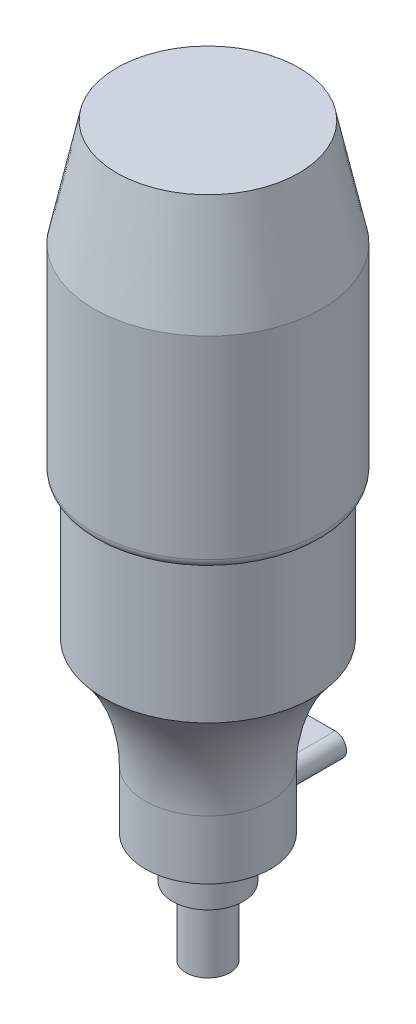
ISO-10303-21;
HEADER;
FILE_DESCRIPTION(('STEP AP214'),'2;1');
FILE_NAME('part.step','',(''),(''),'','','');
FILE_SCHEMA(('AUTOMOTIVE_DESIGN { 1 0 10303 214 1 1 1 1 }'));
ENDSEC;
DATA;
#1=APPLICATION_CONTEXT('core data for automotive mechanical design processes');
#2=APPLICATION_PROTOCOL_DEFINITION('international standard','automotive_design',2000,#1);
#3=PRODUCT_CONTEXT('',#1,'mechanical');
#4=PRODUCT('Part','Part','',(#3));
#5=PRODUCT_RELATED_PRODUCT_CATEGORY('part','',(#4));
#6=PRODUCT_DEFINITION_FORMATION('','',#4);
#7=PRODUCT_DEFINITION_CONTEXT('part definition',#1,'design');
#8=PRODUCT_DEFINITION('design','',#6,#7);
#9=PRODUCT_DEFINITION_SHAPE('','',#8);
#10=(LENGTH_UNIT() NAMED_UNIT(*) SI_UNIT(.MILLI.,.METRE.));
#11=(NAMED_UNIT(*) PLANE_ANGLE_UNIT() SI_UNIT($,.RADIAN.));
#12=(NAMED_UNIT(*) SI_UNIT($,.STERADIAN.) SOLID_ANGLE_UNIT());
#13=UNCERTAINTY_MEASURE_WITH_UNIT(LENGTH_MEASURE(1.E-05),#10,'distance_accuracy_value','');
#14=(GEOMETRIC_REPRESENTATION_CONTEXT(3) GLOBAL_UNCERTAINTY_ASSIGNED_CONTEXT((#13)) GLOBAL_UNIT_ASSIGNED_CONTEXT((#10,
#11,#12)) REPRESENTATION_CONTEXT('',''));
#15=CARTESIAN_POINT('',(0.,0.,0.));
#16=DIRECTION('',(0.,0.,1.));
#17=DIRECTION('',(1.,0.,0.));
#18=AXIS2_PLACEMENT_3D('',#15,#16,#17);
#19=CARTESIAN_POINT('',(24.,173.5,0.));
#20=DIRECTION('',(0.,-1.,0.));
#21=DIRECTION('',(0.,0.,-1.));
#22=AXIS2_PLACEMENT_3D('',#19,#20,#21);
#23=PLANE('',#22);
#24=CARTESIAN_POINT('',(0.,173.5,0.));
#25=DIRECTION('',(0.,1.,0.));
#26=DIRECTION('',(0.,0.,1.));
#27=AXIS2_PLACEMENT_3D('',#24,#25,#26);
#28=CIRCLE('',#27,24.);
#29=CARTESIAN_POINT('',(0.,173.5,24.));
#30=VERTEX_POINT('',#29);
#31=EDGE_CURVE('E146',#30,#30,#28,.T.);
#32=ORIENTED_EDGE('',*,*,#31,.T.);
#33=EDGE_LOOP('',(#32));
#34=FACE_BOUND('',#33,.T.);
#35=ADVANCED_FACE('F33',(#34),#23,.F.);
#36=CARTESIAN_POINT('',(0.,-18.,0.));
#37=DIRECTION('',(0.,1.,0.));
#38=DIRECTION('',(0.,0.,1.));
#39=AXIS2_PLACEMENT_3D('',#36,#37,#38);
#40=PLANE('',#39);
#41=CARTESIAN_POINT('',(0.,-18.,0.));
#42=DIRECTION('',(0.,1.,0.));
#43=DIRECTION('',(0.,0.,1.));
#44=AXIS2_PLACEMENT_3D('',#41,#42,#43);
#45=CIRCLE('',#44,5.8);
#46=CARTESIAN_POINT('',(0.,-18.,5.8));
#47=VERTEX_POINT('',#46);
#48=EDGE_CURVE('E176',#47,#47,#45,.T.);
#49=ORIENTED_EDGE('',*,*,#48,.F.);
#50=EDGE_LOOP('',(#49));
#51=FACE_BOUND('',#50,.T.);
#52=ADVANCED_FACE('F293',(#51),#40,.F.);
#53=CARTESIAN_POINT('',(0.,182.175,0.));
#54=DIRECTION('',(0.,1.,0.));
#55=DIRECTION('',(0.,0.,1.));
#56=AXIS2_PLACEMENT_3D('',#53,#54,#55);
#57=CYLINDRICAL_SURFACE('',#56,5.8);
#58=CARTESIAN_POINT('',(0.,0.,0.));
#59=DIRECTION('',(0.,1.,0.));
#60=DIRECTION('',(0.,0.,1.));
#61=AXIS2_PLACEMENT_3D('',#58,#59,#60);
#62=CIRCLE('',#61,5.8);
#63=CARTESIAN_POINT('',(0.,0.,5.8));
#64=VERTEX_POINT('',#63);
#65=EDGE_CURVE('E173',#64,#64,#62,.T.);
#66=ORIENTED_EDGE('',*,*,#65,.F.);
#67=EDGE_LOOP('',(#66));
#68=FACE_BOUND('',#67,.T.);
#69=ORIENTED_EDGE('',*,*,#48,.T.);
#70=EDGE_LOOP('',(#69));
#71=FACE_BOUND('',#70,.T.);
#72=ADVANCED_FACE('F287',(#68,#71),#57,.T.);
#73=CARTESIAN_POINT('',(5.8,0.,0.));
#74=DIRECTION('',(0.,1.,0.));
#75=DIRECTION('',(0.,0.,1.));
#76=AXIS2_PLACEMENT_3D('',#73,#74,#75);
#77=PLANE('',#76);
#78=CARTESIAN_POINT('',(0.,0.,0.));
#79=DIRECTION('',(0.,1.,0.));
#80=DIRECTION('',(0.,0.,1.));
#81=AXIS2_PLACEMENT_3D('',#78,#79,#80);
#82=CIRCLE('',#81,9.3);
#83=CARTESIAN_POINT('',(0.,0.,9.3));
#84=VERTEX_POINT('',#83);
#85=EDGE_CURVE('E170',#84,#84,#82,.T.);
#86=ORIENTED_EDGE('',*,*,#85,.F.);
#87=EDGE_LOOP('',(#86));
#88=FACE_BOUND('',#87,.T.);
#89=ORIENTED_EDGE('',*,*,#65,.T.);
#90=EDGE_LOOP('',(#89));
#91=FACE_BOUND('',#90,.T.);
#92=ADVANCED_FACE('F281',(#88,#91),#77,.F.);
#93=CARTESIAN_POINT('',(0.,182.175,0.));
#94=DIRECTION('',(0.,1.,0.));
#95=DIRECTION('',(0.,0.,1.));
#96=AXIS2_PLACEMENT_3D('',#93,#94,#95);
#97=CYLINDRICAL_SURFACE('',#96,9.3);
#98=CARTESIAN_POINT('',(0.,11.,0.));
#99=DIRECTION('',(0.,1.,0.));
#100=DIRECTION('',(0.,0.,1.));
#101=AXIS2_PLACEMENT_3D('',#98,#99,#100);
#102=CIRCLE('',#101,9.3);
#103=CARTESIAN_POINT('',(0.,11.,9.3));
#104=VERTEX_POINT('',#103);
#105=EDGE_CURVE('E167',#104,#104,#102,.T.);
#106=ORIENTED_EDGE('',*,*,#105,.F.);
#107=EDGE_LOOP('',(#106));
#108=FACE_BOUND('',#107,.T.);
#109=ORIENTED_EDGE('',*,*,#85,.T.);
#110=EDGE_LOOP('',(#109));
#111=FACE_BOUND('',#110,.T.);
#112=ADVANCED_FACE('F275',(#108,#111),#97,.T.);
#113=CARTESIAN_POINT('',(9.3,11.,0.));
#114=DIRECTION('',(0.,1.,0.));
#115=DIRECTION('',(0.,0.,1.));
#116=AXIS2_PLACEMENT_3D('',#113,#114,#115);
#117=PLANE('',#116);
#118=CARTESIAN_POINT('',(0.,11.,0.));
#119=DIRECTION('',(0.,1.,0.));
#120=DIRECTION('',(0.,0.,1.));
#121=AXIS2_PLACEMENT_3D('',#118,#119,#120);
#122=CIRCLE('',#121,16.5);
#123=CARTESIAN_POINT('',(0.,11.,16.5));
#124=VERTEX_POINT('',#123);
#125=EDGE_CURVE('E164',#124,#124,#122,.T.);
#126=ORIENTED_EDGE('',*,*,#125,.F.);
#127=EDGE_LOOP('',(#126));
#128=FACE_BOUND('',#127,.T.);
#129=ORIENTED_EDGE('',*,*,#105,.T.);
#130=EDGE_LOOP('',(#129));
#131=FACE_BOUND('',#130,.T.);
#132=ADVANCED_FACE('F269',(#128,#131),#117,.F.);
#133=CARTESIAN_POINT('',(0.,182.175,0.));
#134=DIRECTION('',(0.,1.,0.));
#135=DIRECTION('',(0.,0.,1.));
#136=AXIS2_PLACEMENT_3D('',#133,#134,#135);
#137=CYLINDRICAL_SURFACE('',#136,16.5);
#138=CARTESIAN_POINT('',(0.,15.,0.));
#139=DIRECTION('',(0.,-1.,0.));
#140=DIRECTION('',(0.,0.,-1.));
#141=AXIS2_PLACEMENT_3D('',#138,#139,#140);
#142=CIRCLE('',#141,16.5);
#143=CARTESIAN_POINT('',(3.5,15.,-16.1245154965971));
#144=VERTEX_POINT('',#143);
#145=CARTESIAN_POINT('',(-3.5,15.,-16.1245154965971));
#146=VERTEX_POINT('',#145);
#147=EDGE_CURVE('E106',#144,#146,#142,.F.);
#148=ORIENTED_EDGE('',*,*,#147,.F.);
#149=CARTESIAN_POINT('',(3.5,21.,-16.1245154965971));
#150=CARTESIAN_POINT('',(3.58719127679948,21.0000074508517,-16.1055968253464));
#151=CARTESIAN_POINT('',(3.67421481993883,20.9961990738604,-16.0859599448483));
#152=CARTESIAN_POINT('',(3.84729596228067,20.9810934997403,-16.0454402048859));
#153=CARTESIAN_POINT('',(3.93335378785766,20.9697980965858,-16.0245576449907));
#154=CARTESIAN_POINT('',(4.10379322690174,20.9398826125012,-15.9817584167738));
#155=CARTESIAN_POINT('',(4.1881770646077,20.921273045604,-15.9598432724049));
#156=CARTESIAN_POINT('',(4.35480620692929,20.8769338000175,-15.9151851483464));
#157=CARTESIAN_POINT('',(4.43705141588591,20.8512038034347,-15.8924421317356));
#158=CARTESIAN_POINT('',(4.67968699823152,20.7636639678951,-15.8233585287546));
#159=CARTESIAN_POINT('',(4.83620961326289,20.6914629880383,-15.7761045186265));
#160=CARTESIAN_POINT('',(5.13458594513931,20.5214415567286,-15.6815374149478));
#161=CARTESIAN_POINT('',(5.27643502547025,20.4236130418209,-15.6342243074741));
#162=CARTESIAN_POINT('',(5.54417730074027,20.2027170113893,-15.5413166629808));
#163=CARTESIAN_POINT('',(5.66974749704768,20.0792374299611,-15.4957667437151));
#164=CARTESIAN_POINT('',(5.89814068606809,19.8110578735611,-15.4102838447277));
#165=CARTESIAN_POINT('',(6.00096592353674,19.666359995021,-15.370350310853));
#166=CARTESIAN_POINT('',(6.17752003050969,19.3640379731879,-15.3002298263366));
#167=CARTESIAN_POINT('',(6.25202617471471,19.2069289534308,-15.2697874039371));
#168=CARTESIAN_POINT('',(6.37308011696212,18.88069631611,-15.2196647238644));
#169=CARTESIAN_POINT('',(6.41964598912823,18.7115805448899,-15.1999775095553));
#170=CARTESIAN_POINT('',(6.48031831366827,18.3795586988583,-15.1742044107183));
#171=CARTESIAN_POINT('',(6.49656030885867,18.2171107903206,-15.1672246252516));
#172=CARTESIAN_POINT('',(6.50245363172151,17.8916630628638,-15.164699754293));
#173=CARTESIAN_POINT('',(6.49211205501401,17.7286634028151,-15.169151617494));
#174=CARTESIAN_POINT('',(6.44637763095886,17.4143706402084,-15.1886396214108));
#175=CARTESIAN_POINT('',(6.41212139508058,17.2628795220314,-15.2031953747814));
#176=CARTESIAN_POINT('',(6.32113626560412,16.9680086673929,-15.2412482788976));
#177=CARTESIAN_POINT('',(6.26440469035645,16.8246299011922,-15.2647464966019));
#178=CARTESIAN_POINT('',(6.12841750272051,16.5452579681431,-15.3198568386538));
#179=CARTESIAN_POINT('',(6.0485428578337,16.409610718692,-15.3516892574004));
#180=CARTESIAN_POINT('',(5.86947845487117,16.1533751152837,-15.421038408399));
#181=CARTESIAN_POINT('',(5.7702835757904,16.0327907678262,-15.4585566471432));
#182=CARTESIAN_POINT('',(5.54743755286521,15.8009871150444,-15.5399796322453));
#183=CARTESIAN_POINT('',(5.42254504873753,15.691053469669,-15.5841491959985));
#184=CARTESIAN_POINT('',(5.15667728711588,15.4934333192057,-15.6741305833183));
#185=CARTESIAN_POINT('',(5.01569191030875,15.405760925106,-15.7199434276385));
#186=CARTESIAN_POINT('',(4.71350163427726,15.2508716675908,-15.8132589784135));
#187=CARTESIAN_POINT('',(4.5516311284627,15.1849317097264,-15.8607281352226));
#188=CARTESIAN_POINT('',(4.21826057498766,15.0820513154495,-15.9526181197649));
#189=CARTESIAN_POINT('',(4.04677662364551,15.0450638697754,-15.9970437816325));
#190=CARTESIAN_POINT('',(3.81125976849235,15.0155384573525,-16.0539212041423));
#191=CARTESIAN_POINT('',(3.74920977800103,15.0097167714554,-16.0685256961092));
#192=CARTESIAN_POINT('',(3.62480879921612,15.001952063509,-16.0970436300113));
#193=CARTESIAN_POINT('',(3.56245840693183,15.000003197774,-16.1109580821621));
#194=CARTESIAN_POINT('',(3.5,15.,-16.1245154965971));
#195=B_SPLINE_CURVE_WITH_KNOTS('',3,(#149,#150,#151,#152,#153,#154,#155,#156,#157,#158,#159,
#160,#161,#162,#163,#164,#165,#166,#167,#168,#169,#170,#171,#172,#173,#174,#175,#176,#177,#178,
#179,#180,#181,#182,#183,#184,#185,#186,#187,#188,#189,#190,#191,#192,#193,#194),.UNSPECIFIED.,
.F.,.F.,(4,2,2,2,2,2,2,2,2,2,2,2,2,2,2,2,2,2,2,2,2,2,4),(0.,0.267557931060892,0.535051775445972,
0.80216249841422,1.06928514853312,1.60280998398802,2.13650288988991,2.67954382276263,
3.22253113766098,3.74930158347184,4.27573090133389,4.76344020510647,5.2510193442581,
5.71687584889622,6.18278795404217,6.66254034755478,7.14242007731306,7.65660403134237,
8.17111310778129,8.71196075663605,9.25192841645767,9.44386758835397,9.63551692328279),.UNSPECIFIED.);
#196=CARTESIAN_POINT('',(3.5,21.,-16.1245154965971));
#197=VERTEX_POINT('',#196);
#198=EDGE_CURVE('E96',#197,#144,#195,.T.);
#199=ORIENTED_EDGE('',*,*,#198,.F.);
#200=CARTESIAN_POINT('',(0.,21.,0.));
#201=DIRECTION('',(0.,1.,0.));
#202=DIRECTION('',(0.,0.,1.));
#203=AXIS2_PLACEMENT_3D('',#200,#201,#202);
#204=CIRCLE('',#203,16.5);
#205=CARTESIAN_POINT('',(-3.5,21.,-16.1245154965971));
#206=VERTEX_POINT('',#205);
#207=EDGE_CURVE('E115',#206,#197,#204,.F.);
#208=ORIENTED_EDGE('',*,*,#207,.F.);
#209=CARTESIAN_POINT('',(-3.5,15.,-16.1245154965971));
#210=CARTESIAN_POINT('',(-3.58719127679948,14.9999925491483,-16.1055968253464));
#211=CARTESIAN_POINT('',(-3.67421481993883,15.0038009261396,-16.0859599448483));
#212=CARTESIAN_POINT('',(-3.84729596228066,15.0189065002597,-16.0454402048859));
#213=CARTESIAN_POINT('',(-3.93335378785766,15.0302019034143,-16.0245576449907));
#214=CARTESIAN_POINT('',(-4.10379322690174,15.0601173874988,-15.9817584167738));
#215=CARTESIAN_POINT('',(-4.1881770646077,15.078726954396,-15.9598432724049));
#216=CARTESIAN_POINT('',(-4.35480620692929,15.1230661999825,-15.9151851483464));
#217=CARTESIAN_POINT('',(-4.43705141588591,15.1487961965653,-15.8924421317356));
#218=CARTESIAN_POINT('',(-4.67968699823152,15.2363360321049,-15.8233585287546));
#219=CARTESIAN_POINT('',(-4.83620961326289,15.3085370119617,-15.7761045186265));
#220=CARTESIAN_POINT('',(-5.1345859451393,15.4785584432714,-15.6815374149478));
#221=CARTESIAN_POINT('',(-5.27643502547025,15.5763869581791,-15.6342243074741));
#222=CARTESIAN_POINT('',(-5.54417730074027,15.7972829886107,-15.5413166629808));
#223=CARTESIAN_POINT('',(-5.66974749704768,15.9207625700389,-15.4957667437151));
#224=CARTESIAN_POINT('',(-5.89814068606809,16.1889421264389,-15.4102838447277));
#225=CARTESIAN_POINT('',(-6.00096592353674,16.333640004979,-15.370350310853));
#226=CARTESIAN_POINT('',(-6.17752003050969,16.6359620268121,-15.3002298263366));
#227=CARTESIAN_POINT('',(-6.25202617471471,16.7930710465692,-15.2697874039371));
#228=CARTESIAN_POINT('',(-6.37308011696212,17.11930368389,-15.2196647238644));
#229=CARTESIAN_POINT('',(-6.41964598912823,17.2884194551102,-15.1999775095553));
#230=CARTESIAN_POINT('',(-6.48031831366827,17.6204413011418,-15.1742044107183));
#231=CARTESIAN_POINT('',(-6.49656030885867,17.7828892096794,-15.1672246252516));
#232=CARTESIAN_POINT('',(-6.50245363172151,18.1083369371362,-15.164699754293));
#233=CARTESIAN_POINT('',(-6.49211205501401,18.2713365971849,-15.169151617494));
#234=CARTESIAN_POINT('',(-6.44637763095886,18.5856293597916,-15.1886396214108));
#235=CARTESIAN_POINT('',(-6.41212139508058,18.7371204779686,-15.2031953747814));
#236=CARTESIAN_POINT('',(-6.32113626560412,19.0319913326071,-15.2412482788976));
#237=CARTESIAN_POINT('',(-6.26440469035645,19.1753700988078,-15.2647464966019));
#238=CARTESIAN_POINT('',(-6.12841750272051,19.4547420318569,-15.3198568386538));
#239=CARTESIAN_POINT('',(-6.0485428578337,19.590389281308,-15.3516892574004));
#240=CARTESIAN_POINT('',(-5.86947845487117,19.8466248847163,-15.421038408399));
#241=CARTESIAN_POINT('',(-5.7702835757904,19.9672092321738,-15.4585566471432));
#242=CARTESIAN_POINT('',(-5.54743755286521,20.1990128849556,-15.5399796322453));
#243=CARTESIAN_POINT('',(-5.42254504873753,20.3089465303311,-15.5841491959985));
#244=CARTESIAN_POINT('',(-5.15667728711588,20.5065666807944,-15.6741305833183));
#245=CARTESIAN_POINT('',(-5.01569191030875,20.594239074894,-15.7199434276385));
#246=CARTESIAN_POINT('',(-4.71350163427726,20.7491283324093,-15.8132589784135));
#247=CARTESIAN_POINT('',(-4.5516311284627,20.8150682902736,-15.8607281352226));
#248=CARTESIAN_POINT('',(-4.21826057498766,20.9179486845505,-15.9526181197649));
#249=CARTESIAN_POINT('',(-4.04677662364551,20.9549361302247,-15.9970437816325));
#250=CARTESIAN_POINT('',(-3.81125976849236,20.9844615426476,-16.0539212041423));
#251=CARTESIAN_POINT('',(-3.74920977800103,20.9902832285447,-16.0685256961092));
#252=CARTESIAN_POINT('',(-3.62480879921612,20.998047936491,-16.0970436300113));
#253=CARTESIAN_POINT('',(-3.56245840693183,20.999996802226,-16.1109580821621));
#254=CARTESIAN_POINT('',(-3.5,21.,-16.1245154965971));
#255=B_SPLINE_CURVE_WITH_KNOTS('',3,(#209,#210,#211,#212,#213,#214,#215,#216,#217,#218,#219,
#220,#221,#222,#223,#224,#225,#226,#227,#228,#229,#230,#231,#232,#233,#234,#235,#236,#237,#238,
#239,#240,#241,#242,#243,#244,#245,#246,#247,#248,#249,#250,#251,#252,#253,#254),.UNSPECIFIED.,
.F.,.F.,(4,2,2,2,2,2,2,2,2,2,2,2,2,2,2,2,2,2,2,2,2,2,4),(0.,0.267557931060892,0.535051775445972,
0.802162498414222,1.06928514853312,1.60280998398802,2.13650288988991,2.67954382276263,
3.22253113766098,3.74930158347184,4.27573090133389,4.76344020510647,5.2510193442581,
5.71687584889622,6.18278795404217,6.66254034755478,7.14242007731306,7.65660403134237,
8.17111310778128,8.71196075663605,9.25192841645767,9.44386758835397,9.63551692328279),.UNSPECIFIED.);
#256=EDGE_CURVE('E120',#146,#206,#255,.T.);
#257=ORIENTED_EDGE('',*,*,#256,.F.);
#258=EDGE_LOOP('',(#148,#199,#208,#257));
#259=FACE_BOUND('',#258,.T.);
#260=CARTESIAN_POINT('',(0.,26.5,0.));
#261=DIRECTION('',(0.,1.,0.));
#262=DIRECTION('',(0.,0.,1.));
#263=AXIS2_PLACEMENT_3D('',#260,#261,#262);
#264=CIRCLE('',#263,16.5);
#265=CARTESIAN_POINT('',(0.,26.5,16.5));
#266=VERTEX_POINT('',#265);
#267=EDGE_CURVE('E161',#266,#266,#264,.T.);
#268=ORIENTED_EDGE('',*,*,#267,.F.);
#269=EDGE_LOOP('',(#268));
#270=FACE_BOUND('',#269,.T.);
#271=ORIENTED_EDGE('',*,*,#125,.T.);
#272=EDGE_LOOP('',(#271));
#273=FACE_BOUND('',#272,.T.);
#274=ADVANCED_FACE('F118',(#259,#270,#273),#137,.T.);
#275=CARTESIAN_POINT('',(0.,26.5,0.));
#276=DIRECTION('',(0.,1.,0.));
#277=DIRECTION('',(0.,0.,1.));
#278=AXIS2_PLACEMENT_3D('',#275,#276,#277);
#279=TOROIDAL_SURFACE('',#278,60.2272727272728,43.7272727272728);
#280=CARTESIAN_POINT('',(0.,55.5,0.));
#281=DIRECTION('',(0.,1.,0.));
#282=DIRECTION('',(0.,0.,1.));
#283=AXIS2_PLACEMENT_3D('',#280,#281,#282);
#284=CIRCLE('',#283,27.5);
#285=CARTESIAN_POINT('',(0.,55.5,27.5));
#286=VERTEX_POINT('',#285);
#287=EDGE_CURVE('E158',#286,#286,#284,.T.);
#288=ORIENTED_EDGE('',*,*,#287,.F.);
#289=EDGE_LOOP('',(#288));
#290=FACE_BOUND('',#289,.T.);
#291=ORIENTED_EDGE('',*,*,#267,.T.);
#292=EDGE_LOOP('',(#291));
#293=FACE_BOUND('',#292,.T.);
#294=ADVANCED_FACE('F259',(#290,#293),#279,.F.);
#295=CARTESIAN_POINT('',(0.,182.175,0.));
#296=DIRECTION('',(0.,1.,0.));
#297=DIRECTION('',(0.,0.,1.));
#298=AXIS2_PLACEMENT_3D('',#295,#296,#297);
#299=CYLINDRICAL_SURFACE('',#298,27.5);
#300=CARTESIAN_POINT('',(0.,92.,0.));
#301=DIRECTION('',(0.,1.,0.));
#302=DIRECTION('',(0.,0.,1.));
#303=AXIS2_PLACEMENT_3D('',#300,#301,#302);
#304=CIRCLE('',#303,27.5);
#305=CARTESIAN_POINT('',(0.,92.,27.5));
#306=VERTEX_POINT('',#305);
#307=EDGE_CURVE('E155',#306,#306,#304,.T.);
#308=ORIENTED_EDGE('',*,*,#307,.F.);
#309=EDGE_LOOP('',(#308));
#310=FACE_BOUND('',#309,.T.);
#311=ORIENTED_EDGE('',*,*,#287,.T.);
#312=EDGE_LOOP('',(#311));
#313=FACE_BOUND('',#312,.T.);
#314=ADVANCED_FACE('F253',(#310,#313),#299,.T.);
#315=CARTESIAN_POINT('',(0.,94.5,0.));
#316=DIRECTION('',(0.,1.,0.));
#317=DIRECTION('',(0.,0.,1.));
#318=AXIS2_PLACEMENT_3D('',#315,#316,#317);
#319=TOROIDAL_SURFACE('',#318,27.5,2.5);
#320=CARTESIAN_POINT('',(0.,94.5,0.));
#321=DIRECTION('',(0.,1.,0.));
#322=DIRECTION('',(0.,0.,1.));
#323=AXIS2_PLACEMENT_3D('',#320,#321,#322);
#324=CIRCLE('',#323,30.);
#325=CARTESIAN_POINT('',(0.,94.5,30.));
#326=VERTEX_POINT('',#325);
#327=EDGE_CURVE('E152',#326,#326,#324,.T.);
#328=ORIENTED_EDGE('',*,*,#327,.F.);
#329=EDGE_LOOP('',(#328));
#330=FACE_BOUND('',#329,.T.);
#331=ORIENTED_EDGE('',*,*,#307,.T.);
#332=EDGE_LOOP('',(#331));
#333=FACE_BOUND('',#332,.T.);
#334=ADVANCED_FACE('F245',(#330,#333),#319,.T.);
#335=CARTESIAN_POINT('',(0.,182.175,0.));
#336=DIRECTION('',(0.,1.,0.));
#337=DIRECTION('',(0.,0.,1.));
#338=AXIS2_PLACEMENT_3D('',#335,#336,#337);
#339=CYLINDRICAL_SURFACE('',#338,30.);
#340=CARTESIAN_POINT('',(0.,118.,0.));
#341=DIRECTION('',(0.,-1.,0.));
#342=DIRECTION('',(0.,0.,-1.));
#343=AXIS2_PLACEMENT_3D('',#340,#341,#342);
#344=CIRCLE('',#343,30.);
#345=CARTESIAN_POINT('',(-19.,118.,-23.2163735324878));
#346=VERTEX_POINT('',#345);
#347=CARTESIAN_POINT('',(19.,118.,-23.2163735324878));
#348=VERTEX_POINT('',#347);
#349=EDGE_CURVE('E128',#346,#348,#344,.T.);
#350=ORIENTED_EDGE('',*,*,#349,.T.);
#351=DIRECTION('',(0.,1.,0.));
#352=VECTOR('',#351,1.);
#353=CARTESIAN_POINT('',(19.,182.175,-23.2163735324878));
#354=LINE('',#353,#352);
#355=CARTESIAN_POINT('',(19.,135.5,-23.2163735324878));
#356=VERTEX_POINT('',#355);
#357=EDGE_CURVE('E143',#348,#356,#354,.T.);
#358=ORIENTED_EDGE('',*,*,#357,.T.);
#359=CARTESIAN_POINT('',(0.,135.5,0.));
#360=DIRECTION('',(0.,1.,0.));
#361=DIRECTION('',(0.,0.,1.));
#362=AXIS2_PLACEMENT_3D('',#359,#360,#361);
#363=CIRCLE('',#362,30.);
#364=CARTESIAN_POINT('',(-19.,135.5,-23.2163735324878));
#365=VERTEX_POINT('',#364);
#366=EDGE_CURVE('E141',#356,#365,#363,.T.);
#367=ORIENTED_EDGE('',*,*,#366,.T.);
#368=DIRECTION('',(0.,1.,0.));
#369=VECTOR('',#368,1.);
#370=CARTESIAN_POINT('',(-19.,182.175,-23.2163735324878));
#371=LINE('',#370,#369);
#372=EDGE_CURVE('E138',#365,#346,#371,.F.);
#373=ORIENTED_EDGE('',*,*,#372,.T.);
#374=EDGE_LOOP('',(#350,#358,#367,#373));
#375=FACE_BOUND('',#374,.T.);
#376=CARTESIAN_POINT('',(0.,145.5,0.));
#377=DIRECTION('',(0.,1.,0.));
#378=DIRECTION('',(0.,0.,1.));
#379=AXIS2_PLACEMENT_3D('',#376,#377,#378);
#380=CIRCLE('',#379,30.);
#381=CARTESIAN_POINT('',(0.,145.5,30.));
#382=VERTEX_POINT('',#381);
#383=EDGE_CURVE('E149',#382,#382,#380,.T.);
#384=ORIENTED_EDGE('',*,*,#383,.F.);
#385=EDGE_LOOP('',(#384));
#386=FACE_BOUND('',#385,.T.);
#387=ORIENTED_EDGE('',*,*,#327,.T.);
#388=EDGE_LOOP('',(#387));
#389=FACE_BOUND('',#388,.T.);
#390=ADVANCED_FACE('F241',(#375,#386,#389),#339,.T.);
#391=CARTESIAN_POINT('',(0.,145.5,0.));
#392=DIRECTION('',(0.,-1.,0.));
#393=DIRECTION('',(0.,0.,-1.));
#394=AXIS2_PLACEMENT_3D('',#391,#392,#393);
#395=CONICAL_SURFACE('',#394,30.,0.211093333222746);
#396=ORIENTED_EDGE('',*,*,#31,.F.);
#397=EDGE_LOOP('',(#396));
#398=FACE_BOUND('',#397,.T.);
#399=ORIENTED_EDGE('',*,*,#383,.T.);
#400=EDGE_LOOP('',(#399));
#401=FACE_BOUND('',#400,.T.);
#402=ADVANCED_FACE('F244',(#398,#401),#395,.T.);
#403=CARTESIAN_POINT('',(19.,135.5,-20.));
#404=DIRECTION('',(1.,0.,0.));
#405=DIRECTION('',(0.,1.,0.));
#406=AXIS2_PLACEMENT_3D('',#403,#404,#405);
#407=PLANE('',#406);
#408=DIRECTION('',(0.,0.,-1.));
#409=VECTOR('',#408,1.);
#410=CARTESIAN_POINT('',(19.,118.,-20.));
#411=LINE('',#410,#409);
#412=CARTESIAN_POINT('',(19.,118.,-21.9089023002066));
#413=VERTEX_POINT('',#412);
#414=EDGE_CURVE('E133',#413,#348,#411,.T.);
#415=ORIENTED_EDGE('',*,*,#414,.F.);
#416=DIRECTION('',(0.,1.,0.));
#417=VECTOR('',#416,1.);
#418=CARTESIAN_POINT('',(19.,182.175,-21.9089023002066));
#419=LINE('',#418,#417);
#420=CARTESIAN_POINT('',(19.,135.5,-21.9089023002066));
#421=VERTEX_POINT('',#420);
#422=EDGE_CURVE('E11',#413,#421,#419,.T.);
#423=ORIENTED_EDGE('',*,*,#422,.T.);
#424=DIRECTION('',(0.,0.,-1.));
#425=VECTOR('',#424,1.);
#426=CARTESIAN_POINT('',(19.,135.5,-20.));
#427=LINE('',#426,#425);
#428=EDGE_CURVE('E125',#421,#356,#427,.T.);
#429=ORIENTED_EDGE('',*,*,#428,.T.);
#430=ORIENTED_EDGE('',*,*,#357,.F.);
#431=EDGE_LOOP('',(#415,#423,#429,#430));
#432=FACE_BOUND('',#431,.T.);
#433=ADVANCED_FACE('F239',(#432),#407,.F.);
#434=CARTESIAN_POINT('',(19.,135.5,-20.));
#435=DIRECTION('',(0.,1.,0.));
#436=DIRECTION('',(0.,0.,1.));
#437=AXIS2_PLACEMENT_3D('',#434,#435,#436);
#438=PLANE('',#437);
#439=ORIENTED_EDGE('',*,*,#428,.F.);
#440=CARTESIAN_POINT('',(0.,135.5,0.));
#441=DIRECTION('',(0.,1.,0.));
#442=DIRECTION('',(0.,0.,1.));
#443=AXIS2_PLACEMENT_3D('',#440,#441,#442);
#444=CIRCLE('',#443,29.);
#445=CARTESIAN_POINT('',(-19.,135.5,-21.9089023002066));
#446=VERTEX_POINT('',#445);
#447=EDGE_CURVE('E40',#421,#446,#444,.T.);
#448=ORIENTED_EDGE('',*,*,#447,.T.);
#449=DIRECTION('',(0.,0.,-1.));
#450=VECTOR('',#449,1.);
#451=CARTESIAN_POINT('',(-19.,135.5,-20.));
#452=LINE('',#451,#450);
#453=EDGE_CURVE('E129',#446,#365,#452,.T.);
#454=ORIENTED_EDGE('',*,*,#453,.T.);
#455=ORIENTED_EDGE('',*,*,#366,.F.);
#456=EDGE_LOOP('',(#439,#448,#454,#455));
#457=FACE_BOUND('',#456,.T.);
#458=ADVANCED_FACE('F225',(#457),#438,.F.);
#459=CARTESIAN_POINT('',(-19.,135.5,-20.));
#460=DIRECTION('',(-1.,0.,0.));
#461=DIRECTION('',(0.,-1.,0.));
#462=AXIS2_PLACEMENT_3D('',#459,#460,#461);
#463=PLANE('',#462);
#464=ORIENTED_EDGE('',*,*,#453,.F.);
#465=DIRECTION('',(0.,1.,0.));
#466=VECTOR('',#465,1.);
#467=CARTESIAN_POINT('',(-19.,182.175,-21.9089023002066));
#468=LINE('',#467,#466);
#469=CARTESIAN_POINT('',(-19.,118.,-21.9089023002066));
#470=VERTEX_POINT('',#469);
#471=EDGE_CURVE('E220',#446,#470,#468,.F.);
#472=ORIENTED_EDGE('',*,*,#471,.T.);
#473=DIRECTION('',(0.,0.,-1.));
#474=VECTOR('',#473,1.);
#475=CARTESIAN_POINT('',(-19.,118.,-20.));
#476=LINE('',#475,#474);
#477=EDGE_CURVE('E55',#470,#346,#476,.T.);
#478=ORIENTED_EDGE('',*,*,#477,.T.);
#479=ORIENTED_EDGE('',*,*,#372,.F.);
#480=EDGE_LOOP('',(#464,#472,#478,#479));
#481=FACE_BOUND('',#480,.T.);
#482=ADVANCED_FACE('F231',(#481),#463,.F.);
#483=CARTESIAN_POINT('',(19.,118.,-20.));
#484=DIRECTION('',(0.,-1.,0.));
#485=DIRECTION('',(0.,0.,-1.));
#486=AXIS2_PLACEMENT_3D('',#483,#484,#485);
#487=PLANE('',#486);
#488=ORIENTED_EDGE('',*,*,#349,.F.);
#489=ORIENTED_EDGE('',*,*,#477,.F.);
#490=CARTESIAN_POINT('',(0.,118.,0.));
#491=DIRECTION('',(0.,-1.,0.));
#492=DIRECTION('',(0.,0.,-1.));
#493=AXIS2_PLACEMENT_3D('',#490,#491,#492);
#494=CIRCLE('',#493,29.);
#495=EDGE_CURVE('E218',#470,#413,#494,.T.);
#496=ORIENTED_EDGE('',*,*,#495,.T.);
#497=ORIENTED_EDGE('',*,*,#414,.T.);
#498=EDGE_LOOP('',(#488,#489,#496,#497));
#499=FACE_BOUND('',#498,.T.);
#500=ADVANCED_FACE('F236',(#499),#487,.F.);
#501=CARTESIAN_POINT('',(24.,172.5,0.));
#502=DIRECTION('',(0.,-1.,0.));
#503=DIRECTION('',(0.,0.,-1.));
#504=AXIS2_PLACEMENT_3D('',#501,#502,#503);
#505=PLANE('',#504);
#506=CARTESIAN_POINT('',(0.,172.5,0.));
#507=DIRECTION('',(0.,1.,0.));
#508=DIRECTION('',(0.,0.,1.));
#509=AXIS2_PLACEMENT_3D('',#506,#507,#508);
#510=CIRCLE('',#509,23.191584209766);
#511=CARTESIAN_POINT('',(0.,172.5,23.191584209766));
#512=VERTEX_POINT('',#511);
#513=EDGE_CURVE('E215',#512,#512,#510,.T.);
#514=ORIENTED_EDGE('',*,*,#513,.F.);
#515=EDGE_LOOP('',(#514));
#516=FACE_BOUND('',#515,.T.);
#517=ADVANCED_FACE('F353',(#516),#505,.T.);
#518=CARTESIAN_POINT('',(0.,145.394059645575,0.));
#519=DIRECTION('',(0.,-1.,0.));
#520=DIRECTION('',(0.,0.,-1.));
#521=AXIS2_PLACEMENT_3D('',#518,#519,#520);
#522=CONICAL_SURFACE('',#521,29.,0.211093333222746);
#523=ORIENTED_EDGE('',*,*,#513,.T.);
#524=EDGE_LOOP('',(#523));
#525=FACE_BOUND('',#524,.T.);
#526=CARTESIAN_POINT('',(0.,145.394059645575,0.));
#527=DIRECTION('',(0.,1.,0.));
#528=DIRECTION('',(0.,0.,1.));
#529=AXIS2_PLACEMENT_3D('',#526,#527,#528);
#530=CIRCLE('',#529,29.);
#531=CARTESIAN_POINT('',(0.,145.394059645575,29.));
#532=VERTEX_POINT('',#531);
#533=EDGE_CURVE('E212',#532,#532,#530,.T.);
#534=ORIENTED_EDGE('',*,*,#533,.F.);
#535=EDGE_LOOP('',(#534));
#536=FACE_BOUND('',#535,.T.);
#537=ADVANCED_FACE('F351',(#525,#536),#522,.F.);
#538=CARTESIAN_POINT('',(0.,182.175,0.));
#539=DIRECTION('',(0.,1.,0.));
#540=DIRECTION('',(0.,0.,1.));
#541=AXIS2_PLACEMENT_3D('',#538,#539,#540);
#542=CYLINDRICAL_SURFACE('',#541,29.);
#543=ORIENTED_EDGE('',*,*,#422,.F.);
#544=ORIENTED_EDGE('',*,*,#495,.F.);
#545=ORIENTED_EDGE('',*,*,#471,.F.);
#546=ORIENTED_EDGE('',*,*,#447,.F.);
#547=EDGE_LOOP('',(#543,#544,#545,#546));
#548=FACE_BOUND('',#547,.T.);
#549=ORIENTED_EDGE('',*,*,#533,.T.);
#550=EDGE_LOOP('',(#549));
#551=FACE_BOUND('',#550,.T.);
#552=CARTESIAN_POINT('',(0.,94.5,0.));
#553=DIRECTION('',(0.,1.,0.));
#554=DIRECTION('',(0.,0.,1.));
#555=AXIS2_PLACEMENT_3D('',#552,#553,#554);
#556=CIRCLE('',#555,29.);
#557=CARTESIAN_POINT('',(0.,94.5,29.));
#558=VERTEX_POINT('',#557);
#559=EDGE_CURVE('E209',#558,#558,#556,.T.);
#560=ORIENTED_EDGE('',*,*,#559,.F.);
#561=EDGE_LOOP('',(#560));
#562=FACE_BOUND('',#561,.T.);
#563=ADVANCED_FACE('F233',(#548,#551,#562),#542,.F.);
#564=CARTESIAN_POINT('',(0.,94.5,0.));
#565=DIRECTION('',(0.,1.,0.));
#566=DIRECTION('',(0.,0.,1.));
#567=AXIS2_PLACEMENT_3D('',#564,#565,#566);
#568=TOROIDAL_SURFACE('',#567,27.5,1.5);
#569=ORIENTED_EDGE('',*,*,#559,.T.);
#570=EDGE_LOOP('',(#569));
#571=FACE_BOUND('',#570,.T.);
#572=CARTESIAN_POINT('',(0.,93.3819660112501,0.));
#573=DIRECTION('',(0.,1.,0.));
#574=DIRECTION('',(0.,0.,1.));
#575=AXIS2_PLACEMENT_3D('',#572,#573,#574);
#576=CIRCLE('',#575,26.5);
#577=CARTESIAN_POINT('',(0.,93.3819660112501,26.5));
#578=VERTEX_POINT('',#577);
#579=EDGE_CURVE('E206',#578,#578,#576,.T.);
#580=ORIENTED_EDGE('',*,*,#579,.F.);
#581=EDGE_LOOP('',(#580));
#582=FACE_BOUND('',#581,.T.);
#583=ADVANCED_FACE('F344',(#571,#582),#568,.F.);
#584=CARTESIAN_POINT('',(0.,182.175,0.));
#585=DIRECTION('',(0.,1.,0.));
#586=DIRECTION('',(0.,0.,1.));
#587=AXIS2_PLACEMENT_3D('',#584,#585,#586);
#588=CYLINDRICAL_SURFACE('',#587,26.5);
#589=ORIENTED_EDGE('',*,*,#579,.T.);
#590=EDGE_LOOP('',(#589));
#591=FACE_BOUND('',#590,.T.);
#592=CARTESIAN_POINT('',(0.,55.8768616431368,0.));
#593=DIRECTION('',(0.,1.,0.));
#594=DIRECTION('',(0.,0.,1.));
#595=AXIS2_PLACEMENT_3D('',#592,#593,#594);
#596=CIRCLE('',#595,26.5);
#597=CARTESIAN_POINT('',(0.,55.8768616431368,26.5));
#598=VERTEX_POINT('',#597);
#599=EDGE_CURVE('E203',#598,#598,#596,.T.);
#600=ORIENTED_EDGE('',*,*,#599,.F.);
#601=EDGE_LOOP('',(#600));
#602=FACE_BOUND('',#601,.T.);
#603=ADVANCED_FACE('F340',(#591,#602),#588,.F.);
#604=CARTESIAN_POINT('',(0.,26.5,0.));
#605=DIRECTION('',(0.,1.,0.));
#606=DIRECTION('',(0.,0.,1.));
#607=AXIS2_PLACEMENT_3D('',#604,#605,#606);
#608=TOROIDAL_SURFACE('',#607,60.2272727272728,44.7272727272728);
#609=ORIENTED_EDGE('',*,*,#599,.T.);
#610=EDGE_LOOP('',(#609));
#611=FACE_BOUND('',#610,.T.);
#612=CARTESIAN_POINT('',(0.,26.5,0.));
#613=DIRECTION('',(0.,1.,0.));
#614=DIRECTION('',(0.,0.,1.));
#615=AXIS2_PLACEMENT_3D('',#612,#613,#614);
#616=CIRCLE('',#615,15.5);
#617=CARTESIAN_POINT('',(0.,26.5,15.5));
#618=VERTEX_POINT('',#617);
#619=EDGE_CURVE('E200',#618,#618,#616,.T.);
#620=ORIENTED_EDGE('',*,*,#619,.F.);
#621=EDGE_LOOP('',(#620));
#622=FACE_BOUND('',#621,.T.);
#623=ADVANCED_FACE('F336',(#611,#622),#608,.T.);
#624=CARTESIAN_POINT('',(0.,182.175,0.));
#625=DIRECTION('',(0.,1.,0.));
#626=DIRECTION('',(0.,0.,1.));
#627=AXIS2_PLACEMENT_3D('',#624,#625,#626);
#628=CYLINDRICAL_SURFACE('',#627,15.5);
#629=ORIENTED_EDGE('',*,*,#619,.T.);
#630=EDGE_LOOP('',(#629));
#631=FACE_BOUND('',#630,.T.);
#632=CARTESIAN_POINT('',(0.,12.,0.));
#633=DIRECTION('',(0.,1.,0.));
#634=DIRECTION('',(0.,0.,1.));
#635=AXIS2_PLACEMENT_3D('',#632,#633,#634);
#636=CIRCLE('',#635,15.5);
#637=CARTESIAN_POINT('',(0.,12.,15.5));
#638=VERTEX_POINT('',#637);
#639=EDGE_CURVE('E197',#638,#638,#636,.T.);
#640=ORIENTED_EDGE('',*,*,#639,.F.);
#641=EDGE_LOOP('',(#640));
#642=FACE_BOUND('',#641,.T.);
#643=ADVANCED_FACE('F332',(#631,#642),#628,.F.);
#644=CARTESIAN_POINT('',(9.3,12.,0.));
#645=DIRECTION('',(0.,1.,0.));
#646=DIRECTION('',(0.,0.,1.));
#647=AXIS2_PLACEMENT_3D('',#644,#645,#646);
#648=PLANE('',#647);
#649=ORIENTED_EDGE('',*,*,#639,.T.);
#650=EDGE_LOOP('',(#649));
#651=FACE_BOUND('',#650,.T.);
#652=CARTESIAN_POINT('',(0.,12.,0.));
#653=DIRECTION('',(0.,1.,0.));
#654=DIRECTION('',(0.,0.,1.));
#655=AXIS2_PLACEMENT_3D('',#652,#653,#654);
#656=CIRCLE('',#655,8.3);
#657=CARTESIAN_POINT('',(0.,12.,8.3));
#658=VERTEX_POINT('',#657);
#659=EDGE_CURVE('E194',#658,#658,#656,.T.);
#660=ORIENTED_EDGE('',*,*,#659,.F.);
#661=EDGE_LOOP('',(#660));
#662=FACE_BOUND('',#661,.T.);
#663=ADVANCED_FACE('F328',(#651,#662),#648,.T.);
#664=CARTESIAN_POINT('',(0.,182.175,0.));
#665=DIRECTION('',(0.,1.,0.));
#666=DIRECTION('',(0.,0.,1.));
#667=AXIS2_PLACEMENT_3D('',#664,#665,#666);
#668=CYLINDRICAL_SURFACE('',#667,8.3);
#669=ORIENTED_EDGE('',*,*,#659,.T.);
#670=EDGE_LOOP('',(#669));
#671=FACE_BOUND('',#670,.T.);
#672=CARTESIAN_POINT('',(0.,1.,0.));
#673=DIRECTION('',(0.,1.,0.));
#674=DIRECTION('',(0.,0.,1.));
#675=AXIS2_PLACEMENT_3D('',#672,#673,#674);
#676=CIRCLE('',#675,8.3);
#677=CARTESIAN_POINT('',(0.,1.,8.3));
#678=VERTEX_POINT('',#677);
#679=EDGE_CURVE('E191',#678,#678,#676,.T.);
#680=ORIENTED_EDGE('',*,*,#679,.F.);
#681=EDGE_LOOP('',(#680));
#682=FACE_BOUND('',#681,.T.);
#683=ADVANCED_FACE('F324',(#671,#682),#668,.F.);
#684=CARTESIAN_POINT('',(5.8,1.,0.));
#685=DIRECTION('',(0.,1.,0.));
#686=DIRECTION('',(0.,0.,1.));
#687=AXIS2_PLACEMENT_3D('',#684,#685,#686);
#688=PLANE('',#687);
#689=ORIENTED_EDGE('',*,*,#679,.T.);
#690=EDGE_LOOP('',(#689));
#691=FACE_BOUND('',#690,.T.);
#692=CARTESIAN_POINT('',(0.,1.,0.));
#693=DIRECTION('',(0.,1.,0.));
#694=DIRECTION('',(0.,0.,1.));
#695=AXIS2_PLACEMENT_3D('',#692,#693,#694);
#696=CIRCLE('',#695,4.8);
#697=CARTESIAN_POINT('',(0.,1.,4.8));
#698=VERTEX_POINT('',#697);
#699=EDGE_CURVE('E188',#698,#698,#696,.T.);
#700=ORIENTED_EDGE('',*,*,#699,.F.);
#701=EDGE_LOOP('',(#700));
#702=FACE_BOUND('',#701,.T.);
#703=ADVANCED_FACE('F320',(#691,#702),#688,.T.);
#704=CARTESIAN_POINT('',(0.,182.175,0.));
#705=DIRECTION('',(0.,1.,0.));
#706=DIRECTION('',(0.,0.,1.));
#707=AXIS2_PLACEMENT_3D('',#704,#705,#706);
#708=CYLINDRICAL_SURFACE('',#707,4.8);
#709=ORIENTED_EDGE('',*,*,#699,.T.);
#710=EDGE_LOOP('',(#709));
#711=FACE_BOUND('',#710,.T.);
#712=CARTESIAN_POINT('',(0.,-17.,0.));
#713=DIRECTION('',(0.,1.,0.));
#714=DIRECTION('',(0.,0.,1.));
#715=AXIS2_PLACEMENT_3D('',#712,#713,#714);
#716=CIRCLE('',#715,4.8);
#717=CARTESIAN_POINT('',(0.,-17.,4.8));
#718=VERTEX_POINT('',#717);
#719=EDGE_CURVE('E185',#718,#718,#716,.T.);
#720=ORIENTED_EDGE('',*,*,#719,.F.);
#721=EDGE_LOOP('',(#720));
#722=FACE_BOUND('',#721,.T.);
#723=ADVANCED_FACE('F316',(#711,#722),#708,.F.);
#724=CARTESIAN_POINT('',(0.,-17.,0.));
#725=DIRECTION('',(0.,1.,0.));
#726=DIRECTION('',(0.,0.,1.));
#727=AXIS2_PLACEMENT_3D('',#724,#725,#726);
#728=PLANE('',#727);
#729=ORIENTED_EDGE('',*,*,#719,.T.);
#730=EDGE_LOOP('',(#729));
#731=FACE_BOUND('',#730,.T.);
#732=CARTESIAN_POINT('',(0.,-17.,0.));
#733=DIRECTION('',(0.,1.,0.));
#734=DIRECTION('',(0.,0.,1.));
#735=AXIS2_PLACEMENT_3D('',#732,#733,#734);
#736=CIRCLE('',#735,1.);
#737=CARTESIAN_POINT('',(0.,-17.,1.));
#738=VERTEX_POINT('',#737);
#739=EDGE_CURVE('E182',#738,#738,#736,.T.);
#740=ORIENTED_EDGE('',*,*,#739,.F.);
#741=EDGE_LOOP('',(#740));
#742=FACE_BOUND('',#741,.T.);
#743=ADVANCED_FACE('F312',(#731,#742),#728,.T.);
#744=CARTESIAN_POINT('',(0.,182.175,0.));
#745=DIRECTION('',(0.,1.,0.));
#746=DIRECTION('',(0.,0.,1.));
#747=AXIS2_PLACEMENT_3D('',#744,#745,#746);
#748=CYLINDRICAL_SURFACE('',#747,1.);
#749=ORIENTED_EDGE('',*,*,#739,.T.);
#750=EDGE_LOOP('',(#749));
#751=FACE_BOUND('',#750,.T.);
#752=CARTESIAN_POINT('',(0.,0.,0.));
#753=DIRECTION('',(0.,1.,0.));
#754=DIRECTION('',(0.,0.,1.));
#755=AXIS2_PLACEMENT_3D('',#752,#753,#754);
#756=CIRCLE('',#755,1.);
#757=CARTESIAN_POINT('',(0.,0.,1.));
#758=VERTEX_POINT('',#757);
#759=EDGE_CURVE('E179',#758,#758,#756,.T.);
#760=ORIENTED_EDGE('',*,*,#759,.F.);
#761=EDGE_LOOP('',(#760));
#762=FACE_BOUND('',#761,.T.);
#763=ADVANCED_FACE('F307',(#751,#762),#748,.T.);
#764=CARTESIAN_POINT('',(0.,0.,0.));
#765=DIRECTION('',(0.,1.,0.));
#766=DIRECTION('',(0.,0.,1.));
#767=AXIS2_PLACEMENT_3D('',#764,#765,#766);
#768=PLANE('',#767);
#769=ORIENTED_EDGE('',*,*,#759,.T.);
#770=EDGE_LOOP('',(#769));
#771=FACE_BOUND('',#770,.T.);
#772=ADVANCED_FACE('F304',(#771),#768,.T.);
#773=CARTESIAN_POINT('',(3.5,18.,500000.));
#774=DIRECTION('',(0.,0.,-1.));
#775=DIRECTION('',(-1.,0.,0.));
#776=AXIS2_PLACEMENT_3D('',#773,#774,#775);
#777=CYLINDRICAL_SURFACE('',#776,3.);
#778=DIRECTION('',(0.,0.,-1.));
#779=VECTOR('',#778,1.);
#780=CARTESIAN_POINT('',(3.5,21.,500000.));
#781=LINE('',#780,#779);
#782=CARTESIAN_POINT('',(3.5,21.,-30.));
#783=VERTEX_POINT('',#782);
#784=EDGE_CURVE('E102',#197,#783,#781,.T.);
#785=ORIENTED_EDGE('',*,*,#784,.F.);
#786=ORIENTED_EDGE('',*,*,#198,.T.);
#787=DIRECTION('',(0.,0.,-1.));
#788=VECTOR('',#787,1.);
#789=CARTESIAN_POINT('',(3.5,15.,500000.));
#790=LINE('',#789,#788);
#791=CARTESIAN_POINT('',(3.5,15.,-30.));
#792=VERTEX_POINT('',#791);
#793=EDGE_CURVE('E100',#144,#792,#790,.T.);
#794=ORIENTED_EDGE('',*,*,#793,.T.);
#795=CARTESIAN_POINT('',(3.5,18.,-30.));
#796=DIRECTION('',(0.,0.,-1.));
#797=DIRECTION('',(1.,0.,0.));
#798=AXIS2_PLACEMENT_3D('',#795,#796,#797);
#799=CIRCLE('',#798,3.);
#800=EDGE_CURVE('E136',#783,#792,#799,.T.);
#801=ORIENTED_EDGE('',*,*,#800,.F.);
#802=EDGE_LOOP('',(#785,#786,#794,#801));
#803=FACE_BOUND('',#802,.T.);
#804=ADVANCED_FACE('F98',(#803),#777,.T.);
#805=CARTESIAN_POINT('',(-3.5,15.,500000.));
#806=DIRECTION('',(0.,-1.,0.));
#807=DIRECTION('',(0.,0.,-1.));
#808=AXIS2_PLACEMENT_3D('',#805,#806,#807);
#809=PLANE('',#808);
#810=ORIENTED_EDGE('',*,*,#793,.F.);
#811=ORIENTED_EDGE('',*,*,#147,.T.);
#812=DIRECTION('',(0.,0.,-1.));
#813=VECTOR('',#812,1.);
#814=CARTESIAN_POINT('',(-3.5,15.,500000.));
#815=LINE('',#814,#813);
#816=CARTESIAN_POINT('',(-3.5,15.,-30.));
#817=VERTEX_POINT('',#816);
#818=EDGE_CURVE('E114',#146,#817,#815,.T.);
#819=ORIENTED_EDGE('',*,*,#818,.T.);
#820=DIRECTION('',(-1.,0.,0.));
#821=VECTOR('',#820,1.);
#822=CARTESIAN_POINT('',(-3.5,15.,-30.));
#823=LINE('',#822,#821);
#824=EDGE_CURVE('E112',#792,#817,#823,.T.);
#825=ORIENTED_EDGE('',*,*,#824,.F.);
#826=EDGE_LOOP('',(#810,#811,#819,#825));
#827=FACE_BOUND('',#826,.T.);
#828=ADVANCED_FACE('F109',(#827),#809,.T.);
#829=CARTESIAN_POINT('',(-3.5,18.,500000.));
#830=DIRECTION('',(0.,0.,-1.));
#831=DIRECTION('',(-1.,0.,0.));
#832=AXIS2_PLACEMENT_3D('',#829,#830,#831);
#833=CYLINDRICAL_SURFACE('',#832,3.);
#834=ORIENTED_EDGE('',*,*,#818,.F.);
#835=ORIENTED_EDGE('',*,*,#256,.T.);
#836=DIRECTION('',(0.,0.,-1.));
#837=VECTOR('',#836,1.);
#838=CARTESIAN_POINT('',(-3.5,21.,500000.));
#839=LINE('',#838,#837);
#840=CARTESIAN_POINT('',(-3.5,21.,-30.));
#841=VERTEX_POINT('',#840);
#842=EDGE_CURVE('E47',#206,#841,#839,.T.);
#843=ORIENTED_EDGE('',*,*,#842,.T.);
#844=CARTESIAN_POINT('',(-3.5,18.,-30.));
#845=DIRECTION('',(0.,0.,-1.));
#846=DIRECTION('',(1.,0.,0.));
#847=AXIS2_PLACEMENT_3D('',#844,#845,#846);
#848=CIRCLE('',#847,3.);
#849=EDGE_CURVE('E500',#817,#841,#848,.T.);
#850=ORIENTED_EDGE('',*,*,#849,.F.);
#851=EDGE_LOOP('',(#834,#835,#843,#850));
#852=FACE_BOUND('',#851,.T.);
#853=ADVANCED_FACE('F453',(#852),#833,.T.);
#854=CARTESIAN_POINT('',(3.5,21.,500000.));
#855=DIRECTION('',(0.,1.,0.));
#856=DIRECTION('',(0.,0.,1.));
#857=AXIS2_PLACEMENT_3D('',#854,#855,#856);
#858=PLANE('',#857);
#859=ORIENTED_EDGE('',*,*,#842,.F.);
#860=ORIENTED_EDGE('',*,*,#207,.T.);
#861=ORIENTED_EDGE('',*,*,#784,.T.);
#862=DIRECTION('',(1.,0.,0.));
#863=VECTOR('',#862,1.);
#864=CARTESIAN_POINT('',(3.5,21.,-30.));
#865=LINE('',#864,#863);
#866=EDGE_CURVE('E497',#841,#783,#865,.T.);
#867=ORIENTED_EDGE('',*,*,#866,.F.);
#868=EDGE_LOOP('',(#859,#860,#861,#867));
#869=FACE_BOUND('',#868,.T.);
#870=ADVANCED_FACE('F462',(#869),#858,.T.);
#871=CARTESIAN_POINT('',(3.5,18.,-30.));
#872=DIRECTION('',(0.,0.,1.));
#873=DIRECTION('',(1.,0.,0.));
#874=AXIS2_PLACEMENT_3D('',#871,#872,#873);
#875=PLANE('',#874);
#876=ORIENTED_EDGE('',*,*,#800,.T.);
#877=ORIENTED_EDGE('',*,*,#824,.T.);
#878=ORIENTED_EDGE('',*,*,#849,.T.);
#879=ORIENTED_EDGE('',*,*,#866,.T.);
#880=EDGE_LOOP('',(#876,#877,#878,#879));
#881=FACE_BOUND('',#880,.T.);
#882=ADVANCED_FACE('F309',(#881),#875,.F.);
#883=CLOSED_SHELL('',(#35,#52,#72,#92,#112,#132,#274,#294,#314,#334,#390,#402,#433,#458,#482,
#500,#517,#537,#563,#583,#603,#623,#643,#663,#683,#703,#723,#743,#763,#772,#804,#828,#853,#870,#882));
#884=MANIFOLD_SOLID_BREP('B2',#883);
#885=ADVANCED_BREP_SHAPE_REPRESENTATION('',(#18,#884),#14);
#886=SHAPE_DEFINITION_REPRESENTATION(#9,#885);
ENDSEC;
END-ISO-10303-21;
